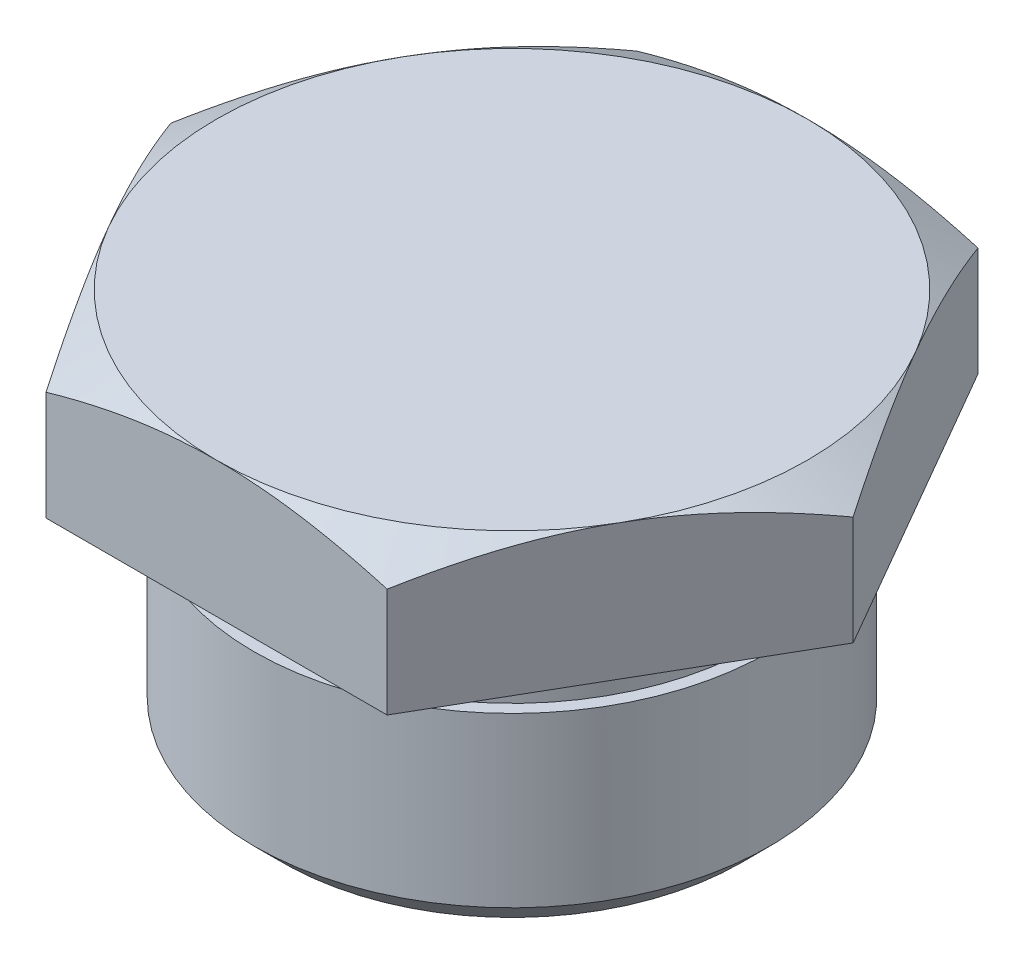
ISO-10303-21;
HEADER;
FILE_DESCRIPTION(('STEP AP214'),'2;1');
FILE_NAME('part.step','',(''),(''),'','','');
FILE_SCHEMA(('AUTOMOTIVE_DESIGN { 1 0 10303 214 1 1 1 1 }'));
ENDSEC;
DATA;
#1=APPLICATION_CONTEXT('core data for automotive mechanical design processes');
#2=APPLICATION_PROTOCOL_DEFINITION('international standard','automotive_design',2000,#1);
#3=PRODUCT_CONTEXT('',#1,'mechanical');
#4=PRODUCT('Part','Part','',(#3));
#5=PRODUCT_RELATED_PRODUCT_CATEGORY('part','',(#4));
#6=PRODUCT_DEFINITION_FORMATION('','',#4);
#7=PRODUCT_DEFINITION_CONTEXT('part definition',#1,'design');
#8=PRODUCT_DEFINITION('design','',#6,#7);
#9=PRODUCT_DEFINITION_SHAPE('','',#8);
#10=(LENGTH_UNIT() NAMED_UNIT(*) SI_UNIT(.MILLI.,.METRE.));
#11=(NAMED_UNIT(*) PLANE_ANGLE_UNIT() SI_UNIT($,.RADIAN.));
#12=(NAMED_UNIT(*) SI_UNIT($,.STERADIAN.) SOLID_ANGLE_UNIT());
#13=UNCERTAINTY_MEASURE_WITH_UNIT(LENGTH_MEASURE(1.E-05),#10,'distance_accuracy_value','');
#14=(GEOMETRIC_REPRESENTATION_CONTEXT(3) GLOBAL_UNCERTAINTY_ASSIGNED_CONTEXT((#13)) GLOBAL_UNIT_ASSIGNED_CONTEXT((#10,
#11,#12)) REPRESENTATION_CONTEXT('',''));
#15=CARTESIAN_POINT('',(0.,0.,0.));
#16=DIRECTION('',(0.,0.,1.));
#17=DIRECTION('',(1.,0.,0.));
#18=AXIS2_PLACEMENT_3D('',#15,#16,#17);
#19=CARTESIAN_POINT('',(0.,-2.00000000000011,0.));
#20=DIRECTION('',(0.,-1.,0.));
#21=DIRECTION('',(0.,0.,-1.));
#22=AXIS2_PLACEMENT_3D('',#19,#20,#21);
#23=CONICAL_SURFACE('',#22,7.33425000000021,1.0471975511966);
#24=CARTESIAN_POINT('',(0.,2.234431211804,3.33066907387547E-13));
#25=VERTEX_POINT('',#24);
#26=VERTEX_LOOP('',#25);
#27=FACE_BOUND('',#26,.T.);
#28=CARTESIAN_POINT('',(0.,-2.,0.));
#29=DIRECTION('',(0.,-1.,0.));
#30=DIRECTION('',(0.,0.,-1.));
#31=AXIS2_PLACEMENT_3D('',#28,#29,#30);
#32=CIRCLE('',#31,7.33425);
#33=CARTESIAN_POINT('',(0.,-2.,-7.33425));
#34=VERTEX_POINT('',#33);
#35=EDGE_CURVE('E343',#34,#34,#32,.T.);
#36=ORIENTED_EDGE('',*,*,#35,.T.);
#37=EDGE_LOOP('',(#36));
#38=FACE_BOUND('',#37,.T.);
#39=ADVANCED_FACE('F17',(#27,#38),#23,.F.);
#40=CARTESIAN_POINT('',(0.,-11.,0.));
#41=DIRECTION('',(0.,-1.,0.));
#42=DIRECTION('',(0.,0.,-1.));
#43=AXIS2_PLACEMENT_3D('',#40,#41,#42);
#44=CYLINDRICAL_SURFACE('',#43,7.33425);
#45=ORIENTED_EDGE('',*,*,#35,.F.);
#46=EDGE_LOOP('',(#45));
#47=FACE_BOUND('',#46,.T.);
#48=CARTESIAN_POINT('',(0.,-9.75,0.));
#49=DIRECTION('',(0.,-1.,0.));
#50=DIRECTION('',(0.,0.,-1.));
#51=AXIS2_PLACEMENT_3D('',#48,#49,#50);
#52=CIRCLE('',#51,7.33425);
#53=CARTESIAN_POINT('',(0.,-9.75,-7.33425));
#54=VERTEX_POINT('',#53);
#55=EDGE_CURVE('E341',#54,#54,#52,.T.);
#56=ORIENTED_EDGE('',*,*,#55,.T.);
#57=EDGE_LOOP('',(#56));
#58=FACE_BOUND('',#57,.T.);
#59=ADVANCED_FACE('F234',(#47,#58),#44,.F.);
#60=CARTESIAN_POINT('',(0.,-10.,0.));
#61=DIRECTION('',(0.,-1.,0.));
#62=DIRECTION('',(0.,0.,-1.));
#63=AXIS2_PLACEMENT_3D('',#60,#61,#62);
#64=CONICAL_SURFACE('',#63,7.58425,0.785398163397452);
#65=ORIENTED_EDGE('',*,*,#55,.F.);
#66=EDGE_LOOP('',(#65));
#67=FACE_BOUND('',#66,.T.);
#68=CARTESIAN_POINT('',(0.,-10.,0.));
#69=DIRECTION('',(0.,-1.,0.));
#70=DIRECTION('',(0.,0.,-1.));
#71=AXIS2_PLACEMENT_3D('',#68,#69,#70);
#72=CIRCLE('',#71,7.58425);
#73=CARTESIAN_POINT('',(0.,-10.,-7.58425));
#74=VERTEX_POINT('',#73);
#75=EDGE_CURVE('E20',#74,#74,#72,.T.);
#76=ORIENTED_EDGE('',*,*,#75,.T.);
#77=EDGE_LOOP('',(#76));
#78=FACE_BOUND('',#77,.T.);
#79=ADVANCED_FACE('F231',(#67,#78),#64,.F.);
#80=CARTESIAN_POINT('',(0.,-10.,0.));
#81=DIRECTION('',(0.,1.,0.));
#82=DIRECTION('',(0.,0.,1.));
#83=AXIS2_PLACEMENT_3D('',#80,#81,#82);
#84=PLANE('',#83);
#85=ORIENTED_EDGE('',*,*,#75,.F.);
#86=EDGE_LOOP('',(#85));
#87=FACE_BOUND('',#86,.T.);
#88=CARTESIAN_POINT('',(0.,-10.,0.));
#89=DIRECTION('',(0.,1.,0.));
#90=DIRECTION('',(-1.,0.,0.));
#91=AXIS2_PLACEMENT_3D('',#88,#89,#90);
#92=CIRCLE('',#91,9.3155);
#93=CARTESIAN_POINT('',(-9.3155,-10.,0.));
#94=VERTEX_POINT('',#93);
#95=EDGE_CURVE('E340',#94,#94,#92,.T.);
#96=ORIENTED_EDGE('',*,*,#95,.F.);
#97=EDGE_LOOP('',(#96));
#98=FACE_BOUND('',#97,.T.);
#99=ADVANCED_FACE('F227',(#87,#98),#84,.F.);
#100=CARTESIAN_POINT('',(0.,-8.838,0.));
#101=DIRECTION('',(0.,1.,0.));
#102=DIRECTION('',(-1.,0.,0.));
#103=AXIS2_PLACEMENT_3D('',#100,#101,#102);
#104=CONICAL_SURFACE('',#103,10.4775,0.785398163397448);
#105=ORIENTED_EDGE('',*,*,#95,.T.);
#106=EDGE_LOOP('',(#105));
#107=FACE_BOUND('',#106,.T.);
#108=CARTESIAN_POINT('',(0.,-8.838,0.));
#109=DIRECTION('',(0.,1.,0.));
#110=DIRECTION('',(0.,0.,1.));
#111=AXIS2_PLACEMENT_3D('',#108,#109,#110);
#112=CIRCLE('',#111,10.4775);
#113=CARTESIAN_POINT('',(0.,-8.838,10.4775));
#114=VERTEX_POINT('',#113);
#115=EDGE_CURVE('E336',#114,#114,#112,.T.);
#116=ORIENTED_EDGE('',*,*,#115,.F.);
#117=EDGE_LOOP('',(#116));
#118=FACE_BOUND('',#117,.T.);
#119=ADVANCED_FACE('F223',(#107,#118),#104,.T.);
#120=CARTESIAN_POINT('',(0.,0.,0.));
#121=DIRECTION('',(0.,1.,0.));
#122=DIRECTION('',(0.,0.,1.));
#123=AXIS2_PLACEMENT_3D('',#120,#121,#122);
#124=CYLINDRICAL_SURFACE('',#123,10.4775);
#125=ORIENTED_EDGE('',*,*,#115,.T.);
#126=EDGE_LOOP('',(#125));
#127=FACE_BOUND('',#126,.T.);
#128=CARTESIAN_POINT('',(0.,-2.,0.));
#129=DIRECTION('',(0.,1.,0.));
#130=DIRECTION('',(0.,0.,1.));
#131=AXIS2_PLACEMENT_3D('',#128,#129,#130);
#132=CIRCLE('',#131,10.4775);
#133=CARTESIAN_POINT('',(0.,-2.,10.4775));
#134=VERTEX_POINT('',#133);
#135=EDGE_CURVE('E339',#134,#134,#132,.T.);
#136=ORIENTED_EDGE('',*,*,#135,.F.);
#137=EDGE_LOOP('',(#136));
#138=FACE_BOUND('',#137,.T.);
#139=ADVANCED_FACE('F219',(#127,#138),#124,.T.);
#140=CARTESIAN_POINT('',(9.9775,-2.,0.));
#141=DIRECTION('',(0.,1.,0.));
#142=DIRECTION('',(0.,0.,1.));
#143=AXIS2_PLACEMENT_3D('',#140,#141,#142);
#144=PLANE('',#143);
#145=CARTESIAN_POINT('',(0.,-2.,0.));
#146=DIRECTION('',(0.,1.,0.));
#147=DIRECTION('',(0.,0.,1.));
#148=AXIS2_PLACEMENT_3D('',#145,#146,#147);
#149=CIRCLE('',#148,9.9775);
#150=CARTESIAN_POINT('',(0.,-2.,9.9775));
#151=VERTEX_POINT('',#150);
#152=EDGE_CURVE('E335',#151,#151,#149,.T.);
#153=ORIENTED_EDGE('',*,*,#152,.F.);
#154=EDGE_LOOP('',(#153));
#155=FACE_BOUND('',#154,.T.);
#156=ORIENTED_EDGE('',*,*,#135,.T.);
#157=EDGE_LOOP('',(#156));
#158=FACE_BOUND('',#157,.T.);
#159=ADVANCED_FACE('F215',(#155,#158),#144,.T.);
#160=CARTESIAN_POINT('',(0.,0.,0.));
#161=DIRECTION('',(0.,1.,0.));
#162=DIRECTION('',(0.,0.,1.));
#163=AXIS2_PLACEMENT_3D('',#160,#161,#162);
#164=CYLINDRICAL_SURFACE('',#163,9.9775);
#165=ORIENTED_EDGE('',*,*,#152,.T.);
#166=EDGE_LOOP('',(#165));
#167=FACE_BOUND('',#166,.T.);
#168=CARTESIAN_POINT('',(0.,-0.999999999999999,0.));
#169=DIRECTION('',(0.,1.,0.));
#170=DIRECTION('',(0.,0.,1.));
#171=AXIS2_PLACEMENT_3D('',#168,#169,#170);
#172=CIRCLE('',#171,9.9775);
#173=CARTESIAN_POINT('',(0.,-0.999999999999998,9.9775));
#174=VERTEX_POINT('',#173);
#175=EDGE_CURVE('E332',#174,#174,#172,.T.);
#176=ORIENTED_EDGE('',*,*,#175,.F.);
#177=EDGE_LOOP('',(#176));
#178=FACE_BOUND('',#177,.T.);
#179=ADVANCED_FACE('F211',(#167,#178),#164,.T.);
#180=CARTESIAN_POINT('',(0.,0.,0.));
#181=DIRECTION('',(0.,1.,0.));
#182=DIRECTION('',(0.,0.,1.));
#183=AXIS2_PLACEMENT_3D('',#180,#181,#182);
#184=CONICAL_SURFACE('',#183,10.6775,0.610725964389209);
#185=ORIENTED_EDGE('',*,*,#175,.T.);
#186=EDGE_LOOP('',(#185));
#187=FACE_BOUND('',#186,.T.);
#188=CARTESIAN_POINT('',(0.,0.,0.));
#189=DIRECTION('',(0.,1.,0.));
#190=DIRECTION('',(0.,0.,1.));
#191=AXIS2_PLACEMENT_3D('',#188,#189,#190);
#192=CIRCLE('',#191,10.6775);
#193=CARTESIAN_POINT('',(0.,0.,10.6775));
#194=VERTEX_POINT('',#193);
#195=EDGE_CURVE('E313',#194,#194,#192,.T.);
#196=ORIENTED_EDGE('',*,*,#195,.F.);
#197=EDGE_LOOP('',(#196));
#198=FACE_BOUND('',#197,.T.);
#199=ADVANCED_FACE('F207',(#187,#198),#184,.T.);
#200=CARTESIAN_POINT('',(-0.5,0.,0.));
#201=DIRECTION('',(0.,-1.,0.));
#202=DIRECTION('',(0.,0.,-1.));
#203=AXIS2_PLACEMENT_3D('',#200,#201,#202);
#204=PLANE('',#203);
#205=ORIENTED_EDGE('',*,*,#195,.T.);
#206=EDGE_LOOP('',(#205));
#207=FACE_BOUND('',#206,.T.);
#208=DIRECTION('',(-1.,0.,0.));
#209=VECTOR('',#208,1.);
#210=CARTESIAN_POINT('',(-6.92820323027552,0.,12.));
#211=LINE('',#210,#209);
#212=CARTESIAN_POINT('',(6.9282032302755,0.,12.));
#213=VERTEX_POINT('',#212);
#214=CARTESIAN_POINT('',(-6.92820323027551,0.,12.));
#215=VERTEX_POINT('',#214);
#216=EDGE_CURVE('E308',#213,#215,#211,.T.);
#217=ORIENTED_EDGE('',*,*,#216,.T.);
#218=DIRECTION('',(-0.5,0.,-0.866025403784439));
#219=VECTOR('',#218,1.);
#220=CARTESIAN_POINT('',(-13.856406460551,0.,0.));
#221=LINE('',#220,#219);
#222=CARTESIAN_POINT('',(-13.856406460551,0.,0.));
#223=VERTEX_POINT('',#222);
#224=EDGE_CURVE('E316',#215,#223,#221,.T.);
#225=ORIENTED_EDGE('',*,*,#224,.T.);
#226=DIRECTION('',(0.5,0.,-0.866025403784439));
#227=VECTOR('',#226,1.);
#228=CARTESIAN_POINT('',(-6.92820323027551,0.,-12.));
#229=LINE('',#228,#227);
#230=CARTESIAN_POINT('',(-6.92820323027551,0.,-12.));
#231=VERTEX_POINT('',#230);
#232=EDGE_CURVE('E78',#223,#231,#229,.T.);
#233=ORIENTED_EDGE('',*,*,#232,.T.);
#234=DIRECTION('',(1.,0.,0.));
#235=VECTOR('',#234,1.);
#236=CARTESIAN_POINT('',(6.92820323027553,0.,-12.));
#237=LINE('',#236,#235);
#238=CARTESIAN_POINT('',(6.92820323027552,0.,-12.));
#239=VERTEX_POINT('',#238);
#240=EDGE_CURVE('E287',#231,#239,#237,.T.);
#241=ORIENTED_EDGE('',*,*,#240,.T.);
#242=DIRECTION('',(0.5,0.,0.866025403784439));
#243=VECTOR('',#242,1.);
#244=CARTESIAN_POINT('',(13.856406460551,0.,0.));
#245=LINE('',#244,#243);
#246=CARTESIAN_POINT('',(13.856406460551,0.,0.));
#247=VERTEX_POINT('',#246);
#248=EDGE_CURVE('E298',#239,#247,#245,.T.);
#249=ORIENTED_EDGE('',*,*,#248,.T.);
#250=DIRECTION('',(-0.5,0.,0.866025403784438));
#251=VECTOR('',#250,1.);
#252=CARTESIAN_POINT('',(6.9282032302755,0.,12.));
#253=LINE('',#252,#251);
#254=EDGE_CURVE('E303',#247,#213,#253,.T.);
#255=ORIENTED_EDGE('',*,*,#254,.T.);
#256=EDGE_LOOP('',(#217,#225,#233,#241,#249,#255));
#257=FACE_BOUND('',#256,.T.);
#258=ADVANCED_FACE('F202',(#207,#257),#204,.T.);
#259=CARTESIAN_POINT('',(-6.92820323027552,6.5,12.));
#260=DIRECTION('',(0.,0.,-1.));
#261=DIRECTION('',(-1.,0.,0.));
#262=AXIS2_PLACEMENT_3D('',#259,#260,#261);
#263=PLANE('',#262);
#264=DIRECTION('',(0.,1.,0.));
#265=VECTOR('',#264,1.);
#266=CARTESIAN_POINT('',(6.9282032302755,6.5,12.));
#267=LINE('',#266,#265);
#268=CARTESIAN_POINT('',(6.92820322194471,4.42820322546573,12.0000000144294));
#269=VERTEX_POINT('',#268);
#270=EDGE_CURVE('E306',#213,#269,#267,.T.);
#271=ORIENTED_EDGE('',*,*,#270,.T.);
#272=CARTESIAN_POINT('',(0.,5.5,12.));
#273=CARTESIAN_POINT('',(0.294063248069089,5.50004934919644,12.));
#274=CARTESIAN_POINT('',(0.588112493076918,5.49376065584365,12.));
#275=CARTESIAN_POINT('',(1.17563361331625,5.46887261780467,12.));
#276=CARTESIAN_POINT('',(1.46910559131527,5.45027571023861,12.));
#277=CARTESIAN_POINT('',(2.05357625663962,5.40125913418595,12.));
#278=CARTESIAN_POINT('',(2.34457997592719,5.37089898416043,12.));
#279=CARTESIAN_POINT('',(2.92520226428034,5.29900444405136,12.));
#280=CARTESIAN_POINT('',(3.21482079668251,5.25746975984559,12.));
#281=CARTESIAN_POINT('',(3.79202291076353,5.16407313263998,12.));
#282=CARTESIAN_POINT('',(4.07960852358027,5.11222369083075,12.));
#283=CARTESIAN_POINT('',(4.65290693036851,4.99904994393104,12.));
#284=CARTESIAN_POINT('',(4.93861960910154,4.93772506143206,12.));
#285=CARTESIAN_POINT('',(5.79563872867894,4.74024475125546,12.));
#286=CARTESIAN_POINT('',(6.36399146453455,4.59105922160394,12.));
#287=CARTESIAN_POINT('',(6.92820314363695,4.4282032552859,12.));
#288=B_SPLINE_CURVE_WITH_KNOTS('',3,(#272,#273,#274,#275,#276,#277,#278,#279,#280,#281,#282,
#283,#284,#285,#286,#287),.UNSPECIFIED.,.F.,.F.,(4,2,2,2,2,2,2,4),(0.,0.882100041027668,
1.76402547176516,2.64154570135583,3.51908903020487,4.3955752110032,5.27211482365001,
7.03380278117002),.UNSPECIFIED.);
#289=CARTESIAN_POINT('',(0.,5.5,12.));
#290=VERTEX_POINT('',#289);
#291=EDGE_CURVE('E187',#290,#269,#288,.T.);
#292=ORIENTED_EDGE('',*,*,#291,.F.);
#293=CARTESIAN_POINT('',(-6.92820325705382,4.42820319798387,11.9999999624845));
#294=CARTESIAN_POINT('',(-6.36399157273502,4.59105918643292,11.999999990785));
#295=CARTESIAN_POINT('',(-5.79563882823348,4.74024472532296,11.9999999983188));
#296=CARTESIAN_POINT('',(-4.9386196942509,4.93772504330039,12.0000000008365));
#297=CARTESIAN_POINT('',(-4.65290701057536,4.99904992737941,12.0000000002242));
#298=CARTESIAN_POINT('',(-4.07960859390353,5.11222367766623,11.9999999997759));
#299=CARTESIAN_POINT('',(-3.79202297614542,5.16407312128113,11.9999999999399));
#300=CARTESIAN_POINT('',(-3.21482085224577,5.25746975163511,12.0000000000602));
#301=CARTESIAN_POINT('',(-2.92520231496727,5.29900443718953,12.0000000000162));
#302=CARTESIAN_POINT('',(-2.34458001683656,5.37089897968066,11.9999999999838));
#303=CARTESIAN_POINT('',(-2.05357629264794,5.40125913074084,11.9999999999954));
#304=CARTESIAN_POINT('',(-1.46910561728077,5.45027570848759,12.0000000000047));
#305=CARTESIAN_POINT('',(-1.17563363413915,5.46887261670444,12.0000000000023));
#306=CARTESIAN_POINT('',(-0.588112503530572,5.49376065562042,11.9999999999977));
#307=CARTESIAN_POINT('',(-0.294063253295975,5.50004934919699,11.9999999999953));
#308=CARTESIAN_POINT('',(0.,5.5,12.));
#309=B_SPLINE_CURVE_WITH_KNOTS('',3,(#293,#294,#295,#296,#297,#298,#299,#300,#301,#302,#303,
#304,#305,#306,#307,#308),.UNSPECIFIED.,.F.,.F.,(4,2,2,2,2,2,2,4),(0.,1.76168798957445,
2.63822761765953,3.51471381402419,4.39225715791048,5.26977740243967,6.15170284868343,
7.03380290538838),.UNSPECIFIED.);
#310=CARTESIAN_POINT('',(-6.9282032469371,4.42820322546572,12.));
#311=VERTEX_POINT('',#310);
#312=EDGE_CURVE('E193',#311,#290,#309,.T.);
#313=ORIENTED_EDGE('',*,*,#312,.F.);
#314=DIRECTION('',(0.,1.,0.));
#315=VECTOR('',#314,1.);
#316=CARTESIAN_POINT('',(-6.92820323027551,6.5,12.));
#317=LINE('',#316,#315);
#318=EDGE_CURVE('E81',#311,#215,#317,.F.);
#319=ORIENTED_EDGE('',*,*,#318,.T.);
#320=ORIENTED_EDGE('',*,*,#216,.F.);
#321=EDGE_LOOP('',(#271,#292,#313,#319,#320));
#322=FACE_BOUND('',#321,.T.);
#323=ADVANCED_FACE('F198',(#322),#263,.F.);
#324=CARTESIAN_POINT('',(6.9282032302755,6.5,12.));
#325=DIRECTION('',(-0.866025403784438,0.,-0.5));
#326=DIRECTION('',(-0.5,0.,0.866025403784438));
#327=AXIS2_PLACEMENT_3D('',#324,#325,#326);
#328=PLANE('',#327);
#329=DIRECTION('',(0.,1.,0.));
#330=VECTOR('',#329,1.);
#331=CARTESIAN_POINT('',(13.856406460551,6.5,0.));
#332=LINE('',#331,#330);
#333=CARTESIAN_POINT('',(13.8564064538866,4.42820323412322,-1.1543123384595E-08));
#334=VERTEX_POINT('',#333);
#335=EDGE_CURVE('E301',#247,#334,#332,.T.);
#336=ORIENTED_EDGE('',*,*,#335,.T.);
#337=CARTESIAN_POINT('',(10.3923048454133,5.50000000000001,6.));
#338=CARTESIAN_POINT('',(10.5393364707606,5.50004934919816,5.74533375457902));
#339=CARTESIAN_POINT('',(10.686361094577,5.49376065573226,5.49067963616535));
#340=CARTESIAN_POINT('',(10.9801216573134,5.46887261725028,4.98187141624579));
#341=CARTESIAN_POINT('',(11.1268576476172,5.45027570935445,4.7277172257406));
#342=CARTESIAN_POINT('',(11.4190929828596,5.40125913244196,4.22155077733393));
#343=CARTESIAN_POINT('',(11.5645948437793,5.37089898188811,3.96953416162514));
#344=CARTESIAN_POINT('',(11.8549059904909,5.2990044405437,3.46670050551706));
#345=CARTESIAN_POINT('',(11.9997152579511,5.2574697556309,3.21588349686922));
#346=CARTESIAN_POINT('',(12.288316317484,5.16407312685987,2.71601179863994));
#347=CARTESIAN_POINT('',(12.4321091251258,5.1122236841928,2.46695535004141));
#348=CARTESIAN_POINT('',(12.7187583309669,4.99904993545062,1.97046436157533));
#349=CARTESIAN_POINT('',(12.861614671547,4.93772505196699,1.72302992150722));
#350=CARTESIAN_POINT('',(13.2901242349776,4.74024473866279,0.980829586116337));
#351=CARTESIAN_POINT('',(13.5743006053048,4.5910592067087,0.488621674399053));
#352=CARTESIAN_POINT('',(13.8564064472222,4.42820323797094,2.30862674220201E-08));
#353=B_SPLINE_CURVE_WITH_KNOTS('',3,(#337,#338,#339,#340,#341,#342,#343,#344,#345,#346,#347,
#348,#349,#350,#351,#352),.UNSPECIFIED.,.F.,.F.,(4,2,2,2,2,2,2,4),(0.,0.882100048901484,
1.76402548750513,2.64154572486903,3.51908906149268,4.39557525002704,5.27211487041128,
7.03380284358971),.UNSPECIFIED.);
#354=CARTESIAN_POINT('',(10.3923048454133,5.50000000000001,6.));
#355=VERTEX_POINT('',#354);
#356=EDGE_CURVE('E163',#355,#334,#353,.T.);
#357=ORIENTED_EDGE('',*,*,#356,.F.);
#358=CARTESIAN_POINT('',(6.92820321361392,4.42820322065595,12.0000000288587));
#359=CARTESIAN_POINT('',(7.21030905789736,4.59105919181344,11.5113783734477));
#360=CARTESIAN_POINT('',(7.49448543062403,4.7402447260701,11.0191704575745));
#361=CARTESIAN_POINT('',(7.92299499769644,4.93772504250191,10.2769701158757));
#362=CARTESIAN_POINT('',(8.06585133949014,4.99904992697018,10.0295356737056));
#363=CARTESIAN_POINT('',(8.35250054777826,5.11222367755483,9.53304468100116));
#364=CARTESIAN_POINT('',(8.49629335665344,5.16407312107976,9.28398823026632));
#365=CARTESIAN_POINT('',(8.78489441867882,5.2574697514162,8.78411652772001));
#366=CARTESIAN_POINT('',(8.92970368739808,5.29900443703604,8.53329951689136));
#367=CARTESIAN_POINT('',(9.22001483664471,5.37089897961579,8.03046585639248));
#368=CARTESIAN_POINT('',(9.36551669884039,5.40125913069797,7.77844923847369));
#369=CARTESIAN_POINT('',(9.65775203666292,5.45027570847028,7.27228278559801));
#370=CARTESIAN_POINT('',(9.80448802827109,5.46887261669587,7.01812859283366));
#371=CARTESIAN_POINT('',(10.0982485936243,5.49376065562085,6.50932036838169));
#372=CARTESIAN_POINT('',(10.2452732187532,5.50004934919986,6.25466624769477));
#373=CARTESIAN_POINT('',(10.3923048454133,5.50000000000001,6.));
#374=B_SPLINE_CURVE_WITH_KNOTS('',3,(#358,#359,#360,#361,#362,#363,#364,#365,#366,#367,#368,
#369,#370,#371,#372,#373),.UNSPECIFIED.,.F.,.F.,(4,2,2,2,2,2,2,4),(0.,1.76168798883687,
2.63822761695853,3.51471381322892,4.39225715762719,5.26977740276434,6.15170284923415,
7.03380290600945),.UNSPECIFIED.);
#375=EDGE_CURVE('E182',#269,#355,#374,.T.);
#376=ORIENTED_EDGE('',*,*,#375,.F.);
#377=ORIENTED_EDGE('',*,*,#270,.F.);
#378=ORIENTED_EDGE('',*,*,#254,.F.);
#379=EDGE_LOOP('',(#336,#357,#376,#377,#378));
#380=FACE_BOUND('',#379,.T.);
#381=ADVANCED_FACE('F147',(#380),#328,.F.);
#382=CARTESIAN_POINT('',(13.856406460551,6.5,0.));
#383=DIRECTION('',(-0.866025403784439,0.,0.5));
#384=DIRECTION('',(0.5,0.,0.866025403784439));
#385=AXIS2_PLACEMENT_3D('',#382,#383,#384);
#386=PLANE('',#385);
#387=DIRECTION('',(0.,1.,0.));
#388=VECTOR('',#387,1.);
#389=CARTESIAN_POINT('',(6.92820323027553,6.5,-12.));
#390=LINE('',#389,#388);
#391=CARTESIAN_POINT('',(6.92820324693712,4.42820322546571,-12.));
#392=VERTEX_POINT('',#391);
#393=EDGE_CURVE('E283',#239,#392,#390,.T.);
#394=ORIENTED_EDGE('',*,*,#393,.T.);
#395=CARTESIAN_POINT('',(10.3923048454133,5.50000000000001,-6.));
#396=CARTESIAN_POINT('',(10.2452732213787,5.50004934919645,-6.2546662431472));
#397=CARTESIAN_POINT('',(10.0982485988748,5.49376065584366,-6.50932035928761));
#398=CARTESIAN_POINT('',(9.80448803875514,5.46887261780468,-7.01812857467475));
#399=CARTESIAN_POINT('',(9.65775204975563,5.45027571023862,-7.27228276292076));
#400=CARTESIAN_POINT('',(9.36551671709347,5.40125913418596,-7.77844920685843));
#401=CARTESIAN_POINT('',(9.22001485744968,5.37089898416043,-8.03046582035722));
#402=CARTESIAN_POINT('',(8.92970371327311,5.29900444405137,-8.53329947207449));
#403=CARTESIAN_POINT('',(8.78489444707203,5.2574697598456,-8.78411647854153));
#404=CARTESIAN_POINT('',(8.49629339003152,5.16407313264,-9.28398817245378));
#405=CARTESIAN_POINT('',(8.35250058362316,5.11222369083077,-9.53304461891599));
#406=CARTESIAN_POINT('',(8.06585138022904,4.99904994393106,-10.0295356031437));
#407=CARTESIAN_POINT('',(7.92299504086253,4.93772506143208,-10.2769700411098));
#408=CARTESIAN_POINT('',(7.49448548107384,4.74024475125548,-11.0191703701928));
#409=CARTESIAN_POINT('',(7.21030911314603,4.59105922160397,-11.5113782777542));
#410=CARTESIAN_POINT('',(6.92820327359484,4.42820325528594,-11.9999999249687));
#411=B_SPLINE_CURVE_WITH_KNOTS('',3,(#395,#396,#397,#398,#399,#400,#401,#402,#403,#404,#405,
#406,#407,#408,#409,#410),.UNSPECIFIED.,.F.,.F.,(4,2,2,2,2,2,2,4),(0.,0.882100041027652,
1.76402547176513,2.64154570135578,3.51908903020481,4.39557521100313,5.27211482364992,
7.0338027811699),.UNSPECIFIED.);
#412=CARTESIAN_POINT('',(10.3923048454133,5.5,-6.));
#413=VERTEX_POINT('',#412);
#414=EDGE_CURVE('E152',#413,#392,#411,.T.);
#415=ORIENTED_EDGE('',*,*,#414,.F.);
#416=CARTESIAN_POINT('',(13.8564064472222,4.42820323797094,-2.30862582697992E-08));
#417=CARTESIAN_POINT('',(13.5743006053048,4.5910592067087,-0.488621674399044));
#418=CARTESIAN_POINT('',(13.2901242349776,4.74024473866279,-0.980829586116329));
#419=CARTESIAN_POINT('',(12.861614671547,4.93772505196699,-1.72302992150721));
#420=CARTESIAN_POINT('',(12.7187583309669,4.99904993545062,-1.97046436157532));
#421=CARTESIAN_POINT('',(12.4321091251258,5.1122236841928,-2.46695535004141));
#422=CARTESIAN_POINT('',(12.288316317484,5.16407312685987,-2.71601179863994));
#423=CARTESIAN_POINT('',(11.9997152579511,5.2574697556309,-3.21588349686921));
#424=CARTESIAN_POINT('',(11.8549059904909,5.2990044405437,-3.46670050551706));
#425=CARTESIAN_POINT('',(11.5645948437793,5.37089898188812,-3.96953416162514));
#426=CARTESIAN_POINT('',(11.4190929828596,5.40125913244196,-4.22155077733393));
#427=CARTESIAN_POINT('',(11.1268576476172,5.45027570935445,-4.7277172257406));
#428=CARTESIAN_POINT('',(10.9801216573134,5.46887261725028,-4.98187141624579));
#429=CARTESIAN_POINT('',(10.686361094577,5.49376065573225,-5.49067963616535));
#430=CARTESIAN_POINT('',(10.5393364707606,5.50004934919815,-5.74533375457902));
#431=CARTESIAN_POINT('',(10.3923048454133,5.50000000000001,-6.));
#432=B_SPLINE_CURVE_WITH_KNOTS('',3,(#416,#417,#418,#419,#420,#421,#422,#423,#424,#425,#426,
#427,#428,#429,#430,#431),.UNSPECIFIED.,.F.,.F.,(4,2,2,2,2,2,2,4),(0.,1.76168797317843,
2.63822759356267,3.51471378209703,4.39225711872068,5.26977735608459,6.15170279468823,
7.03380284358972),.UNSPECIFIED.);
#433=EDGE_CURVE('E157',#334,#413,#432,.T.);
#434=ORIENTED_EDGE('',*,*,#433,.F.);
#435=ORIENTED_EDGE('',*,*,#335,.F.);
#436=ORIENTED_EDGE('',*,*,#248,.F.);
#437=EDGE_LOOP('',(#394,#415,#434,#435,#436));
#438=FACE_BOUND('',#437,.T.);
#439=ADVANCED_FACE('F141',(#438),#386,.F.);
#440=CARTESIAN_POINT('',(6.92820323027553,6.5,-12.));
#441=DIRECTION('',(0.,0.,1.));
#442=DIRECTION('',(1.,0.,0.));
#443=AXIS2_PLACEMENT_3D('',#440,#441,#442);
#444=PLANE('',#443);
#445=DIRECTION('',(0.,1.,0.));
#446=VECTOR('',#445,1.);
#447=CARTESIAN_POINT('',(-6.92820323027551,6.5,-12.));
#448=LINE('',#447,#446);
#449=CARTESIAN_POINT('',(-6.92820322194471,4.42820322546572,-12.0000000144294));
#450=VERTEX_POINT('',#449);
#451=EDGE_CURVE('E284',#231,#450,#448,.T.);
#452=ORIENTED_EDGE('',*,*,#451,.T.);
#453=CARTESIAN_POINT('',(0.,5.5,-12.));
#454=CARTESIAN_POINT('',(-0.294063248069082,5.50004934919644,-12.));
#455=CARTESIAN_POINT('',(-0.588112493076903,5.49376065584365,-12.));
#456=CARTESIAN_POINT('',(-1.17563361331622,5.46887261780467,-12.));
#457=CARTESIAN_POINT('',(-1.46910559131524,5.45027571023861,-12.));
#458=CARTESIAN_POINT('',(-2.05357625663957,5.40125913418595,-12.));
#459=CARTESIAN_POINT('',(-2.34457997592713,5.37089898416043,-12.));
#460=CARTESIAN_POINT('',(-2.92520226428027,5.29900444405136,-12.));
#461=CARTESIAN_POINT('',(-3.21482079668243,5.25746975984559,-12.));
#462=CARTESIAN_POINT('',(-3.79202291076344,5.16407313263999,-12.));
#463=CARTESIAN_POINT('',(-4.07960852358018,5.11222369083077,-12.));
#464=CARTESIAN_POINT('',(-4.6529069303684,4.99904994393106,-12.));
#465=CARTESIAN_POINT('',(-4.93861960910143,4.93772506143208,-12.));
#466=CARTESIAN_POINT('',(-5.79563872867881,4.74024475125549,-12.));
#467=CARTESIAN_POINT('',(-6.36399146453441,4.59105922160397,-12.));
#468=CARTESIAN_POINT('',(-6.92820314363679,4.42820325528595,-12.));
#469=B_SPLINE_CURVE_WITH_KNOTS('',3,(#453,#454,#455,#456,#457,#458,#459,#460,#461,#462,#463,
#464,#465,#466,#467,#468),.UNSPECIFIED.,.F.,.F.,(4,2,2,2,2,2,2,4),(0.,0.882100041027647,
1.76402547176512,2.64154570135576,3.51908903020479,4.3955752110031,5.27211482364989,
7.03380278116985),.UNSPECIFIED.);
#470=CARTESIAN_POINT('',(0.,5.5,-12.));
#471=VERTEX_POINT('',#470);
#472=EDGE_CURVE('E94',#471,#450,#469,.T.);
#473=ORIENTED_EDGE('',*,*,#472,.F.);
#474=CARTESIAN_POINT('',(6.92820325705385,4.42820319798384,-11.9999999624845));
#475=CARTESIAN_POINT('',(6.36399157273505,4.5910591864329,-11.999999990785));
#476=CARTESIAN_POINT('',(5.79563882823351,4.74024472532294,-11.9999999983188));
#477=CARTESIAN_POINT('',(4.93861969425093,4.93772504330038,-12.0000000008365));
#478=CARTESIAN_POINT('',(4.65290701057539,4.9990499273794,-12.0000000002242));
#479=CARTESIAN_POINT('',(4.07960859390355,5.11222367766623,-11.9999999997759));
#480=CARTESIAN_POINT('',(3.79202297614544,5.16407312128112,-11.9999999999399));
#481=CARTESIAN_POINT('',(3.21482085224579,5.2574697516351,-12.0000000000602));
#482=CARTESIAN_POINT('',(2.92520231496728,5.29900443718953,-12.0000000000162));
#483=CARTESIAN_POINT('',(2.34458001683657,5.37089897968065,-11.9999999999838));
#484=CARTESIAN_POINT('',(2.05357629264795,5.40125913074083,-11.9999999999954));
#485=CARTESIAN_POINT('',(1.46910561728077,5.45027570848759,-12.0000000000047));
#486=CARTESIAN_POINT('',(1.17563363413916,5.46887261670444,-12.0000000000023));
#487=CARTESIAN_POINT('',(0.588112503530573,5.49376065562041,-11.9999999999977));
#488=CARTESIAN_POINT('',(0.294063253295974,5.50004934919699,-11.9999999999953));
#489=CARTESIAN_POINT('',(0.,5.5,-12.));
#490=B_SPLINE_CURVE_WITH_KNOTS('',3,(#474,#475,#476,#477,#478,#479,#480,#481,#482,#483,#484,
#485,#486,#487,#488,#489),.UNSPECIFIED.,.F.,.F.,(4,2,2,2,2,2,2,4),(0.,1.76168798957446,
2.63822761765955,3.51471381402421,4.39225715791051,5.2697774024397,6.15170284868346,
7.03380290538842),.UNSPECIFIED.);
#491=EDGE_CURVE('E132',#392,#471,#490,.T.);
#492=ORIENTED_EDGE('',*,*,#491,.F.);
#493=ORIENTED_EDGE('',*,*,#393,.F.);
#494=ORIENTED_EDGE('',*,*,#240,.F.);
#495=EDGE_LOOP('',(#452,#473,#492,#493,#494));
#496=FACE_BOUND('',#495,.T.);
#497=ADVANCED_FACE('F137',(#496),#444,.F.);
#498=CARTESIAN_POINT('',(-6.92820323027551,6.5,-12.));
#499=DIRECTION('',(0.866025403784439,0.,0.5));
#500=DIRECTION('',(0.5,0.,-0.866025403784439));
#501=AXIS2_PLACEMENT_3D('',#498,#499,#500);
#502=PLANE('',#501);
#503=DIRECTION('',(0.,1.,0.));
#504=VECTOR('',#503,1.);
#505=CARTESIAN_POINT('',(-13.856406460551,6.5,0.));
#506=LINE('',#505,#504);
#507=CARTESIAN_POINT('',(-13.8564064688818,4.42820322546572,-1.44293645032894E-08));
#508=VERTEX_POINT('',#507);
#509=EDGE_CURVE('E73',#223,#508,#506,.T.);
#510=ORIENTED_EDGE('',*,*,#509,.T.);
#511=CARTESIAN_POINT('',(-10.3923048454133,5.5,-6.));
#512=CARTESIAN_POINT('',(-10.5393364694478,5.50004934919644,-5.7453337568528));
#513=CARTESIAN_POINT('',(-10.6863610919517,5.49376065584365,-5.49067964071239));
#514=CARTESIAN_POINT('',(-10.9801216520714,5.46887261780467,-4.98187142532525));
#515=CARTESIAN_POINT('',(-11.1268576410709,5.45027571023861,-4.72771723707923));
#516=CARTESIAN_POINT('',(-11.4190929737331,5.40125913418595,-4.22155079314156));
#517=CARTESIAN_POINT('',(-11.5645948333768,5.37089898416043,-3.96953417964277));
#518=CARTESIAN_POINT('',(-11.8549059775534,5.29900444405136,-3.4667005279255));
#519=CARTESIAN_POINT('',(-11.9997152437545,5.25746975984559,-3.21588352145845));
#520=CARTESIAN_POINT('',(-12.288316300795,5.16407313263999,-2.71601182754621));
#521=CARTESIAN_POINT('',(-12.4321091072034,5.11222369083076,-2.466955381084));
#522=CARTESIAN_POINT('',(-12.7187583105975,4.99904994393105,-1.97046439685625));
#523=CARTESIAN_POINT('',(-12.861614649964,4.93772506143207,-1.72302995889014));
#524=CARTESIAN_POINT('',(-13.2901242097527,4.74024475125548,-0.980829629807147));
#525=CARTESIAN_POINT('',(-13.5743005776805,4.59105922160396,-0.488621722245799));
#526=CARTESIAN_POINT('',(-13.8564064172317,4.42820325528593,-7.50312582818527E-08));
#527=B_SPLINE_CURVE_WITH_KNOTS('',3,(#511,#512,#513,#514,#515,#516,#517,#518,#519,#520,#521,
#522,#523,#524,#525,#526),.UNSPECIFIED.,.F.,.F.,(4,2,2,2,2,2,2,4),(0.,0.882100041027657,
1.76402547176514,2.64154570135579,3.51908903020483,4.39557521100315,5.27211482364996,
7.03380278116994),.UNSPECIFIED.);
#528=CARTESIAN_POINT('',(-10.3923048454133,5.5,-6.));
#529=VERTEX_POINT('',#528);
#530=EDGE_CURVE('E35',#529,#508,#527,.T.);
#531=ORIENTED_EDGE('',*,*,#530,.F.);
#532=CARTESIAN_POINT('',(-6.9282032136139,4.42820322065592,-12.0000000288588));
#533=CARTESIAN_POINT('',(-7.21030905789734,4.59105919181342,-11.5113783734477));
#534=CARTESIAN_POINT('',(-7.49448543062401,4.74024472607009,-11.0191704575745));
#535=CARTESIAN_POINT('',(-7.92299499769643,4.9377250425019,-10.2769701158757));
#536=CARTESIAN_POINT('',(-8.06585133949013,4.99904992697016,-10.0295356737056));
#537=CARTESIAN_POINT('',(-8.35250054777825,5.11222367755482,-9.53304468100119));
#538=CARTESIAN_POINT('',(-8.49629335665343,5.16407312107974,-9.28398823026634));
#539=CARTESIAN_POINT('',(-8.78489441867882,5.25746975141619,-8.78411652772003));
#540=CARTESIAN_POINT('',(-8.92970368739807,5.29900443703603,-8.53329951689139));
#541=CARTESIAN_POINT('',(-9.22001483664471,5.37089897961579,-8.0304658563925));
#542=CARTESIAN_POINT('',(-9.36551669884038,5.40125913069796,-7.77844923847371));
#543=CARTESIAN_POINT('',(-9.65775203666292,5.45027570847028,-7.27228278559803));
#544=CARTESIAN_POINT('',(-9.80448802827109,5.46887261669586,-7.01812859283367));
#545=CARTESIAN_POINT('',(-10.0982485936243,5.49376065562085,-6.50932036838169));
#546=CARTESIAN_POINT('',(-10.2452732187532,5.50004934919985,-6.25466624769477));
#547=CARTESIAN_POINT('',(-10.3923048454133,5.5,-6.));
#548=B_SPLINE_CURVE_WITH_KNOTS('',3,(#532,#533,#534,#535,#536,#537,#538,#539,#540,#541,#542,
#543,#544,#545,#546,#547),.UNSPECIFIED.,.F.,.F.,(4,2,2,2,2,2,2,4),(0.,1.76168798883689,
2.63822761695855,3.51471381322895,4.39225715762722,5.26977740276438,6.1517028492342,
7.03380290600951),.UNSPECIFIED.);
#549=EDGE_CURVE('E92',#450,#529,#548,.T.);
#550=ORIENTED_EDGE('',*,*,#549,.F.);
#551=ORIENTED_EDGE('',*,*,#451,.F.);
#552=ORIENTED_EDGE('',*,*,#232,.F.);
#553=EDGE_LOOP('',(#510,#531,#550,#551,#552));
#554=FACE_BOUND('',#553,.T.);
#555=ADVANCED_FACE('F74',(#554),#502,.F.);
#556=CARTESIAN_POINT('',(-13.856406460551,6.5,0.));
#557=DIRECTION('',(0.866025403784439,0.,-0.5));
#558=DIRECTION('',(-0.5,0.,-0.866025403784439));
#559=AXIS2_PLACEMENT_3D('',#556,#557,#558);
#560=PLANE('',#559);
#561=ORIENTED_EDGE('',*,*,#318,.F.);
#562=CARTESIAN_POINT('',(-10.3923048454133,5.5,6.));
#563=CARTESIAN_POINT('',(-10.2452732213787,5.50004934919644,6.2546662431472));
#564=CARTESIAN_POINT('',(-10.0982485988748,5.49376065584365,6.50932035928761));
#565=CARTESIAN_POINT('',(-9.80448803875514,5.46887261780467,7.01812857467476));
#566=CARTESIAN_POINT('',(-9.65775204975563,5.45027571023861,7.27228276292078));
#567=CARTESIAN_POINT('',(-9.36551671709346,5.40125913418595,7.77844920685846));
#568=CARTESIAN_POINT('',(-9.22001485744967,5.37089898416043,8.03046582035725));
#569=CARTESIAN_POINT('',(-8.9297037132731,5.29900444405136,8.53329947207453));
#570=CARTESIAN_POINT('',(-8.78489444707202,5.25746975984559,8.78411647854157));
#571=CARTESIAN_POINT('',(-8.49629339003151,5.16407313263998,9.28398817245382));
#572=CARTESIAN_POINT('',(-8.35250058362314,5.11222369083076,9.53304461891603));
#573=CARTESIAN_POINT('',(-8.06585138022902,4.99904994393105,10.0295356031438));
#574=CARTESIAN_POINT('',(-7.9229950408625,4.93772506143206,10.2769700411099));
#575=CARTESIAN_POINT('',(-7.49448548107381,4.74024475125547,11.0191703701929));
#576=CARTESIAN_POINT('',(-7.210309113146,4.59105922160395,11.5113782777542));
#577=CARTESIAN_POINT('',(-6.9282032735948,4.42820325528591,11.9999999249688));
#578=B_SPLINE_CURVE_WITH_KNOTS('',3,(#562,#563,#564,#565,#566,#567,#568,#569,#570,#571,#572,
#573,#574,#575,#576,#577),.UNSPECIFIED.,.F.,.F.,(4,2,2,2,2,2,2,4),(0.,0.882100041027664,
1.76402547176515,2.64154570135582,3.51908903020485,4.39557521100318,5.27211482364999,
7.03380278116999),.UNSPECIFIED.);
#579=CARTESIAN_POINT('',(-10.3923048454133,5.5,6.));
#580=VERTEX_POINT('',#579);
#581=EDGE_CURVE('E69',#580,#311,#578,.T.);
#582=ORIENTED_EDGE('',*,*,#581,.F.);
#583=CARTESIAN_POINT('',(-13.8564064414508,4.42820319798385,-4.19484610377709E-08));
#584=CARTESIAN_POINT('',(-13.5743006238003,4.59105918643291,0.488621623933877));
#585=CARTESIAN_POINT('',(-13.290124258074,4.74024472532295,0.980829542749705));
#586=CARTESIAN_POINT('',(-12.8616146932632,4.93772504330038,1.72302988556683));
#587=CARTESIAN_POINT('',(-12.7187583508951,4.9990499273794,1.9704643275071));
#588=CARTESIAN_POINT('',(-12.4321091421709,5.11222367766623,2.46695532007016));
#589=CARTESIAN_POINT('',(-12.2883163334339,5.16407312128113,2.71601177089373));
#590=CARTESIAN_POINT('',(-11.9997152715883,5.25746975163511,3.21588347336931));
#591=CARTESIAN_POINT('',(-11.8549060029109,5.29900443718953,3.4667004840374));
#592=CARTESIAN_POINT('',(-11.5645948538175,5.37089897968066,3.96953414420609));
#593=CARTESIAN_POINT('',(-11.4190929917332,5.40125913074084,4.2215507619551));
#594=CARTESIAN_POINT('',(-11.1268576540577,5.45027570848759,4.72771721459477));
#595=CARTESIAN_POINT('',(-10.9801216624849,5.46887261670444,4.98187140729324));
#596=CARTESIAN_POINT('',(-10.6863610971765,5.49376065562042,5.4906796316581));
#597=CARTESIAN_POINT('',(-10.5393364720572,5.50004934919699,5.74533375232386));
#598=CARTESIAN_POINT('',(-10.3923048454133,5.5,6.));
#599=B_SPLINE_CURVE_WITH_KNOTS('',3,(#583,#584,#585,#586,#587,#588,#589,#590,#591,#592,#593,
#594,#595,#596,#597,#598),.UNSPECIFIED.,.F.,.F.,(4,2,2,2,2,2,2,4),(0.,1.76168798957446,
2.63822761765954,3.51471381402421,4.3922571579105,5.26977740243968,6.15170284868345,
7.0338029053884),.UNSPECIFIED.);
#600=EDGE_CURVE('E84',#508,#580,#599,.T.);
#601=ORIENTED_EDGE('',*,*,#600,.F.);
#602=ORIENTED_EDGE('',*,*,#509,.F.);
#603=ORIENTED_EDGE('',*,*,#224,.F.);
#604=EDGE_LOOP('',(#561,#582,#601,#602,#603));
#605=FACE_BOUND('',#604,.T.);
#606=ADVANCED_FACE('F85',(#605),#560,.F.);
#607=CARTESIAN_POINT('',(0.,4.42177244965716,0.));
#608=DIRECTION('',(0.,-1.,0.));
#609=DIRECTION('',(0.,0.,-1.));
#610=AXIS2_PLACEMENT_3D('',#607,#608,#609);
#611=CONICAL_SURFACE('',#610,13.8675448993143,1.0471975511966);
#612=ORIENTED_EDGE('',*,*,#581,.T.);
#613=ORIENTED_EDGE('',*,*,#312,.T.);
#614=CARTESIAN_POINT('',(0.,5.5,0.));
#615=DIRECTION('',(0.,-1.,0.));
#616=DIRECTION('',(0.,0.,-1.));
#617=AXIS2_PLACEMENT_3D('',#614,#615,#616);
#618=CIRCLE('',#617,12.);
#619=EDGE_CURVE('E88',#580,#290,#618,.F.);
#620=ORIENTED_EDGE('',*,*,#619,.F.);
#621=EDGE_LOOP('',(#612,#613,#620));
#622=FACE_BOUND('',#621,.T.);
#623=ADVANCED_FACE('F178',(#622),#611,.T.);
#624=CARTESIAN_POINT('',(0.,4.42177244965716,0.));
#625=DIRECTION('',(0.,-1.,0.));
#626=DIRECTION('',(0.,0.,-1.));
#627=AXIS2_PLACEMENT_3D('',#624,#625,#626);
#628=CONICAL_SURFACE('',#627,13.8675448993143,1.0471975511966);
#629=ORIENTED_EDGE('',*,*,#291,.T.);
#630=ORIENTED_EDGE('',*,*,#375,.T.);
#631=CARTESIAN_POINT('',(0.,5.5,0.));
#632=DIRECTION('',(0.,-1.,0.));
#633=DIRECTION('',(0.,0.,-1.));
#634=AXIS2_PLACEMENT_3D('',#631,#632,#633);
#635=CIRCLE('',#634,12.);
#636=EDGE_CURVE('E261',#290,#355,#635,.F.);
#637=ORIENTED_EDGE('',*,*,#636,.F.);
#638=EDGE_LOOP('',(#629,#630,#637));
#639=FACE_BOUND('',#638,.T.);
#640=ADVANCED_FACE('F172',(#639),#628,.T.);
#641=CARTESIAN_POINT('',(0.,4.42177244965716,0.));
#642=DIRECTION('',(0.,-1.,0.));
#643=DIRECTION('',(1.,0.,0.));
#644=AXIS2_PLACEMENT_3D('',#641,#642,#643);
#645=CONICAL_SURFACE('',#644,13.8675448993143,1.0471975511966);
#646=ORIENTED_EDGE('',*,*,#356,.T.);
#647=ORIENTED_EDGE('',*,*,#433,.T.);
#648=CARTESIAN_POINT('',(0.,5.5,0.));
#649=DIRECTION('',(0.,-1.,0.));
#650=DIRECTION('',(1.,0.,0.));
#651=AXIS2_PLACEMENT_3D('',#648,#649,#650);
#652=CIRCLE('',#651,12.);
#653=EDGE_CURVE('E256',#355,#413,#652,.F.);
#654=ORIENTED_EDGE('',*,*,#653,.F.);
#655=EDGE_LOOP('',(#646,#647,#654));
#656=FACE_BOUND('',#655,.T.);
#657=ADVANCED_FACE('F168',(#656),#645,.T.);
#658=CARTESIAN_POINT('',(0.,4.42177244965716,0.));
#659=DIRECTION('',(0.,-1.,0.));
#660=DIRECTION('',(0.,0.,-1.));
#661=AXIS2_PLACEMENT_3D('',#658,#659,#660);
#662=CONICAL_SURFACE('',#661,13.8675448993143,1.0471975511966);
#663=ORIENTED_EDGE('',*,*,#491,.T.);
#664=CARTESIAN_POINT('',(0.,5.5,0.));
#665=DIRECTION('',(0.,-1.,0.));
#666=DIRECTION('',(0.,0.,-1.));
#667=AXIS2_PLACEMENT_3D('',#664,#665,#666);
#668=CIRCLE('',#667,12.);
#669=EDGE_CURVE('E254',#413,#471,#668,.F.);
#670=ORIENTED_EDGE('',*,*,#669,.F.);
#671=ORIENTED_EDGE('',*,*,#414,.T.);
#672=EDGE_LOOP('',(#663,#670,#671));
#673=FACE_BOUND('',#672,.T.);
#674=ADVANCED_FACE('F122',(#673),#662,.T.);
#675=CARTESIAN_POINT('',(0.,4.42177244965716,0.));
#676=DIRECTION('',(0.,-1.,0.));
#677=DIRECTION('',(1.,0.,0.));
#678=AXIS2_PLACEMENT_3D('',#675,#676,#677);
#679=CONICAL_SURFACE('',#678,13.8675448993143,1.0471975511966);
#680=ORIENTED_EDGE('',*,*,#472,.T.);
#681=ORIENTED_EDGE('',*,*,#549,.T.);
#682=CARTESIAN_POINT('',(0.,5.5,0.));
#683=DIRECTION('',(0.,-1.,0.));
#684=DIRECTION('',(1.,0.,0.));
#685=AXIS2_PLACEMENT_3D('',#682,#683,#684);
#686=CIRCLE('',#685,12.);
#687=EDGE_CURVE('E26',#471,#529,#686,.F.);
#688=ORIENTED_EDGE('',*,*,#687,.F.);
#689=EDGE_LOOP('',(#680,#681,#688));
#690=FACE_BOUND('',#689,.T.);
#691=ADVANCED_FACE('F117',(#690),#679,.T.);
#692=CARTESIAN_POINT('',(0.,4.42177244965716,0.));
#693=DIRECTION('',(0.,-1.,0.));
#694=DIRECTION('',(1.,0.,0.));
#695=AXIS2_PLACEMENT_3D('',#692,#693,#694);
#696=CONICAL_SURFACE('',#695,13.8675448993143,1.0471975511966);
#697=ORIENTED_EDGE('',*,*,#530,.T.);
#698=ORIENTED_EDGE('',*,*,#600,.T.);
#699=CARTESIAN_POINT('',(0.,5.5,0.));
#700=DIRECTION('',(0.,-1.,0.));
#701=DIRECTION('',(1.,0.,0.));
#702=AXIS2_PLACEMENT_3D('',#699,#700,#701);
#703=CIRCLE('',#702,12.);
#704=EDGE_CURVE('E11',#529,#580,#703,.F.);
#705=ORIENTED_EDGE('',*,*,#704,.F.);
#706=EDGE_LOOP('',(#697,#698,#705));
#707=FACE_BOUND('',#706,.T.);
#708=ADVANCED_FACE('F90',(#707),#696,.T.);
#709=CARTESIAN_POINT('',(-12.,5.5,0.));
#710=DIRECTION('',(0.,1.,0.));
#711=DIRECTION('',(0.,0.,1.));
#712=AXIS2_PLACEMENT_3D('',#709,#710,#711);
#713=PLANE('',#712);
#714=ORIENTED_EDGE('',*,*,#687,.T.);
#715=ORIENTED_EDGE('',*,*,#704,.T.);
#716=ORIENTED_EDGE('',*,*,#619,.T.);
#717=ORIENTED_EDGE('',*,*,#636,.T.);
#718=ORIENTED_EDGE('',*,*,#653,.T.);
#719=ORIENTED_EDGE('',*,*,#669,.T.);
#720=EDGE_LOOP('',(#714,#715,#716,#717,#718,#719));
#721=FACE_BOUND('',#720,.T.);
#722=ADVANCED_FACE('F116',(#721),#713,.T.);
#723=CLOSED_SHELL('',(#39,#59,#79,#99,#119,#139,#159,#179,#199,#258,#323,#381,#439,#497,#555,
#606,#623,#640,#657,#674,#691,#708,#722));
#724=MANIFOLD_SOLID_BREP('B1',#723);
#725=ADVANCED_BREP_SHAPE_REPRESENTATION('',(#18,#724),#14);
#726=SHAPE_DEFINITION_REPRESENTATION(#9,#725);
ENDSEC;
END-ISO-10303-21;
